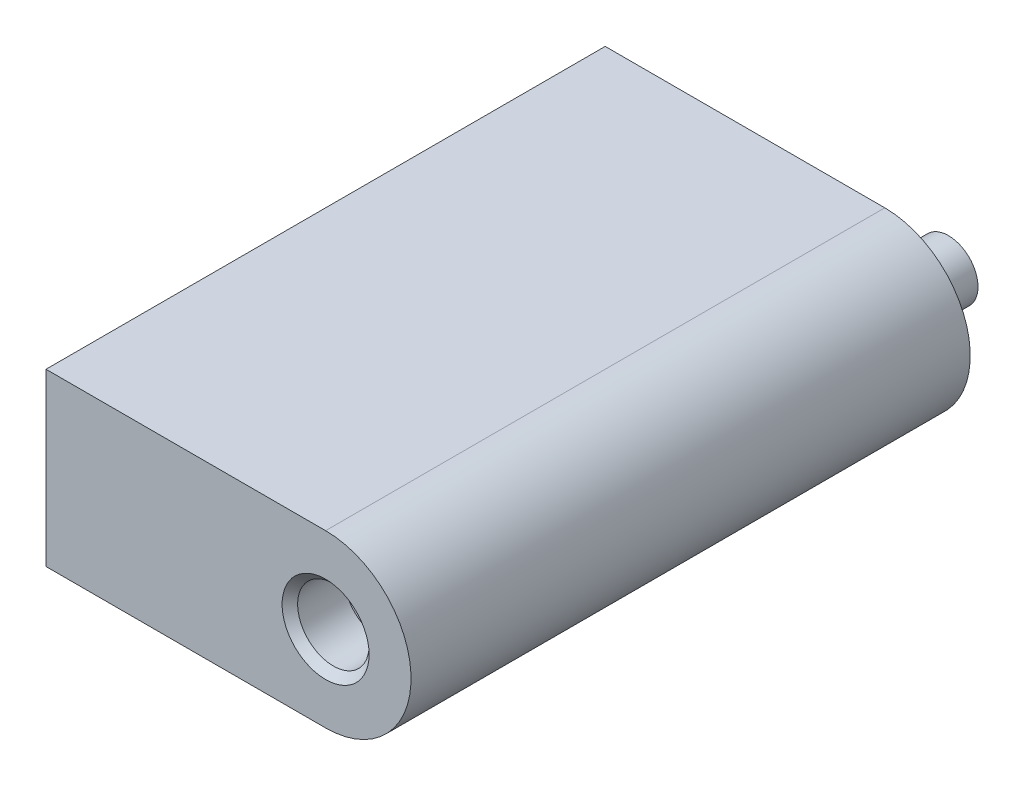
ISO-10303-21;
HEADER;
FILE_DESCRIPTION(('STEP AP214'),'2;1');
FILE_NAME('part.step','',(''),(''),'','','');
FILE_SCHEMA(('AUTOMOTIVE_DESIGN { 1 0 10303 214 1 1 1 1 }'));
ENDSEC;
DATA;
#1=APPLICATION_CONTEXT('core data for automotive mechanical design processes');
#2=APPLICATION_PROTOCOL_DEFINITION('international standard','automotive_design',2000,#1);
#3=PRODUCT_CONTEXT('',#1,'mechanical');
#4=PRODUCT('Part','Part','',(#3));
#5=PRODUCT_RELATED_PRODUCT_CATEGORY('part','',(#4));
#6=PRODUCT_DEFINITION_FORMATION('','',#4);
#7=PRODUCT_DEFINITION_CONTEXT('part definition',#1,'design');
#8=PRODUCT_DEFINITION('design','',#6,#7);
#9=PRODUCT_DEFINITION_SHAPE('','',#8);
#10=(LENGTH_UNIT() NAMED_UNIT(*) SI_UNIT(.MILLI.,.METRE.));
#11=(NAMED_UNIT(*) PLANE_ANGLE_UNIT() SI_UNIT($,.RADIAN.));
#12=(NAMED_UNIT(*) SI_UNIT($,.STERADIAN.) SOLID_ANGLE_UNIT());
#13=UNCERTAINTY_MEASURE_WITH_UNIT(LENGTH_MEASURE(1.E-05),#10,'distance_accuracy_value','');
#14=(GEOMETRIC_REPRESENTATION_CONTEXT(3) GLOBAL_UNCERTAINTY_ASSIGNED_CONTEXT((#13)) GLOBAL_UNIT_ASSIGNED_CONTEXT((#10,
#11,#12)) REPRESENTATION_CONTEXT('',''));
#15=CARTESIAN_POINT('',(0.,0.,0.));
#16=DIRECTION('',(0.,0.,1.));
#17=DIRECTION('',(1.,0.,0.));
#18=AXIS2_PLACEMENT_3D('',#15,#16,#17);
#19=CARTESIAN_POINT('',(0.,0.,36.));
#20=DIRECTION('',(0.,0.,-1.));
#21=DIRECTION('',(-1.,0.,0.));
#22=AXIS2_PLACEMENT_3D('',#19,#20,#21);
#23=CYLINDRICAL_SURFACE('',#22,5.5);
#24=CARTESIAN_POINT('',(0.,0.,0.));
#25=DIRECTION('',(0.,0.,1.));
#26=DIRECTION('',(1.,0.,0.));
#27=AXIS2_PLACEMENT_3D('',#24,#25,#26);
#28=CIRCLE('',#27,5.5);
#29=CARTESIAN_POINT('',(0.,-5.5,0.));
#30=VERTEX_POINT('',#29);
#31=CARTESIAN_POINT('',(0.,5.5,0.));
#32=VERTEX_POINT('',#31);
#33=EDGE_CURVE('E153',#30,#32,#28,.T.);
#34=ORIENTED_EDGE('',*,*,#33,.T.);
#35=DIRECTION('',(0.,0.,-1.));
#36=VECTOR('',#35,1.);
#37=CARTESIAN_POINT('',(0.,5.5,36.));
#38=LINE('',#37,#36);
#39=CARTESIAN_POINT('',(0.,5.5,36.));
#40=VERTEX_POINT('',#39);
#41=EDGE_CURVE('E183',#40,#32,#38,.T.);
#42=ORIENTED_EDGE('',*,*,#41,.F.);
#43=CARTESIAN_POINT('',(0.,0.,36.));
#44=DIRECTION('',(0.,0.,1.));
#45=DIRECTION('',(1.,0.,0.));
#46=AXIS2_PLACEMENT_3D('',#43,#44,#45);
#47=CIRCLE('',#46,5.5);
#48=CARTESIAN_POINT('',(0.,-5.5,36.));
#49=VERTEX_POINT('',#48);
#50=EDGE_CURVE('E157',#49,#40,#47,.T.);
#51=ORIENTED_EDGE('',*,*,#50,.F.);
#52=DIRECTION('',(0.,0.,-1.));
#53=VECTOR('',#52,1.);
#54=CARTESIAN_POINT('',(0.,-5.5,36.));
#55=LINE('',#54,#53);
#56=EDGE_CURVE('E167',#49,#30,#55,.T.);
#57=ORIENTED_EDGE('',*,*,#56,.T.);
#58=EDGE_LOOP('',(#34,#42,#51,#57));
#59=FACE_BOUND('',#58,.T.);
#60=ADVANCED_FACE('F41',(#59),#23,.T.);
#61=CARTESIAN_POINT('',(0.,5.5,36.));
#62=DIRECTION('',(0.,-1.,0.));
#63=DIRECTION('',(0.,0.,-1.));
#64=AXIS2_PLACEMENT_3D('',#61,#62,#63);
#65=PLANE('',#64);
#66=DIRECTION('',(-1.,0.,0.));
#67=VECTOR('',#66,1.);
#68=CARTESIAN_POINT('',(0.,5.5,0.));
#69=LINE('',#68,#67);
#70=CARTESIAN_POINT('',(-18.,5.5,0.));
#71=VERTEX_POINT('',#70);
#72=EDGE_CURVE('E170',#32,#71,#69,.T.);
#73=ORIENTED_EDGE('',*,*,#72,.T.);
#74=DIRECTION('',(0.,0.,-1.));
#75=VECTOR('',#74,1.);
#76=CARTESIAN_POINT('',(-18.,5.5,36.));
#77=LINE('',#76,#75);
#78=CARTESIAN_POINT('',(-18.,5.5,36.));
#79=VERTEX_POINT('',#78);
#80=EDGE_CURVE('E180',#79,#71,#77,.T.);
#81=ORIENTED_EDGE('',*,*,#80,.F.);
#82=DIRECTION('',(-1.,0.,0.));
#83=VECTOR('',#82,1.);
#84=CARTESIAN_POINT('',(0.,5.5,36.));
#85=LINE('',#84,#83);
#86=EDGE_CURVE('E160',#40,#79,#85,.T.);
#87=ORIENTED_EDGE('',*,*,#86,.F.);
#88=ORIENTED_EDGE('',*,*,#41,.T.);
#89=EDGE_LOOP('',(#73,#81,#87,#88));
#90=FACE_BOUND('',#89,.T.);
#91=ADVANCED_FACE('F243',(#90),#65,.F.);
#92=CARTESIAN_POINT('',(-18.,5.5,36.));
#93=DIRECTION('',(1.,0.,0.));
#94=DIRECTION('',(0.,0.,-1.));
#95=AXIS2_PLACEMENT_3D('',#92,#93,#94);
#96=PLANE('',#95);
#97=DIRECTION('',(0.,0.,-1.));
#98=VECTOR('',#97,1.);
#99=CARTESIAN_POINT('',(-18.,-5.,36.));
#100=LINE('',#99,#98);
#101=CARTESIAN_POINT('',(-18.,-5.,32.0475339143616));
#102=VERTEX_POINT('',#101);
#103=CARTESIAN_POINT('',(-18.,-5.,4.04753391436156));
#104=VERTEX_POINT('',#103);
#105=EDGE_CURVE('E203',#102,#104,#100,.T.);
#106=ORIENTED_EDGE('',*,*,#105,.T.);
#107=DIRECTION('',(0.,1.,0.));
#108=VECTOR('',#107,1.);
#109=CARTESIAN_POINT('',(-18.,5.49999999999999,4.04753391436156));
#110=LINE('',#109,#108);
#111=CARTESIAN_POINT('',(-18.,5.,4.04753391436156));
#112=VERTEX_POINT('',#111);
#113=EDGE_CURVE('E205',#104,#112,#110,.T.);
#114=ORIENTED_EDGE('',*,*,#113,.T.);
#115=DIRECTION('',(0.,0.,1.));
#116=VECTOR('',#115,1.);
#117=CARTESIAN_POINT('',(-18.,5.,36.));
#118=LINE('',#117,#116);
#119=CARTESIAN_POINT('',(-18.,5.,32.0475339143616));
#120=VERTEX_POINT('',#119);
#121=EDGE_CURVE('E201',#112,#120,#118,.T.);
#122=ORIENTED_EDGE('',*,*,#121,.T.);
#123=DIRECTION('',(0.,-1.,0.));
#124=VECTOR('',#123,1.);
#125=CARTESIAN_POINT('',(-18.,5.5,32.0475339143616));
#126=LINE('',#125,#124);
#127=EDGE_CURVE('E199',#120,#102,#126,.T.);
#128=ORIENTED_EDGE('',*,*,#127,.T.);
#129=EDGE_LOOP('',(#106,#114,#122,#128));
#130=FACE_BOUND('',#129,.T.);
#131=DIRECTION('',(0.,-1.,0.));
#132=VECTOR('',#131,1.);
#133=CARTESIAN_POINT('',(-18.,5.5,0.));
#134=LINE('',#133,#132);
#135=CARTESIAN_POINT('',(-18.,-5.5,0.));
#136=VERTEX_POINT('',#135);
#137=EDGE_CURVE('E172',#71,#136,#134,.T.);
#138=ORIENTED_EDGE('',*,*,#137,.T.);
#139=DIRECTION('',(0.,0.,-1.));
#140=VECTOR('',#139,1.);
#141=CARTESIAN_POINT('',(-18.,-5.5,36.));
#142=LINE('',#141,#140);
#143=CARTESIAN_POINT('',(-18.,-5.5,36.));
#144=VERTEX_POINT('',#143);
#145=EDGE_CURVE('E177',#144,#136,#142,.T.);
#146=ORIENTED_EDGE('',*,*,#145,.F.);
#147=DIRECTION('',(0.,-1.,0.));
#148=VECTOR('',#147,1.);
#149=CARTESIAN_POINT('',(-18.,5.5,36.));
#150=LINE('',#149,#148);
#151=EDGE_CURVE('E163',#79,#144,#150,.T.);
#152=ORIENTED_EDGE('',*,*,#151,.F.);
#153=ORIENTED_EDGE('',*,*,#80,.T.);
#154=EDGE_LOOP('',(#138,#146,#152,#153));
#155=FACE_BOUND('',#154,.T.);
#156=ADVANCED_FACE('F249',(#130,#155),#96,.F.);
#157=CARTESIAN_POINT('',(-18.,-5.5,36.));
#158=DIRECTION('',(0.,1.,0.));
#159=DIRECTION('',(0.,0.,1.));
#160=AXIS2_PLACEMENT_3D('',#157,#158,#159);
#161=PLANE('',#160);
#162=DIRECTION('',(1.,0.,0.));
#163=VECTOR('',#162,1.);
#164=CARTESIAN_POINT('',(-18.,-5.5,0.));
#165=LINE('',#164,#163);
#166=EDGE_CURVE('E161',#136,#30,#165,.T.);
#167=ORIENTED_EDGE('',*,*,#166,.T.);
#168=ORIENTED_EDGE('',*,*,#56,.F.);
#169=DIRECTION('',(1.,0.,0.));
#170=VECTOR('',#169,1.);
#171=CARTESIAN_POINT('',(-18.,-5.5,36.));
#172=LINE('',#171,#170);
#173=EDGE_CURVE('E165',#144,#49,#172,.T.);
#174=ORIENTED_EDGE('',*,*,#173,.F.);
#175=ORIENTED_EDGE('',*,*,#145,.T.);
#176=EDGE_LOOP('',(#167,#168,#174,#175));
#177=FACE_BOUND('',#176,.T.);
#178=ADVANCED_FACE('F312',(#177),#161,.F.);
#179=CARTESIAN_POINT('',(0.,0.,36.));
#180=DIRECTION('',(0.,0.,1.));
#181=DIRECTION('',(1.,0.,0.));
#182=AXIS2_PLACEMENT_3D('',#179,#180,#181);
#183=PLANE('',#182);
#184=CARTESIAN_POINT('',(0.,0.,36.));
#185=DIRECTION('',(0.,0.,1.));
#186=DIRECTION('',(1.,0.,0.));
#187=AXIS2_PLACEMENT_3D('',#184,#185,#186);
#188=CIRCLE('',#187,2.8);
#189=CARTESIAN_POINT('',(2.8,0.,36.));
#190=VERTEX_POINT('',#189);
#191=EDGE_CURVE('E195',#190,#190,#188,.F.);
#192=ORIENTED_EDGE('',*,*,#191,.T.);
#193=EDGE_LOOP('',(#192));
#194=FACE_BOUND('',#193,.T.);
#195=ORIENTED_EDGE('',*,*,#50,.T.);
#196=ORIENTED_EDGE('',*,*,#86,.T.);
#197=ORIENTED_EDGE('',*,*,#151,.T.);
#198=ORIENTED_EDGE('',*,*,#173,.T.);
#199=EDGE_LOOP('',(#195,#196,#197,#198));
#200=FACE_BOUND('',#199,.T.);
#201=ADVANCED_FACE('F309',(#194,#200),#183,.T.);
#202=CARTESIAN_POINT('',(0.,0.,0.));
#203=DIRECTION('',(0.,0.,1.));
#204=DIRECTION('',(1.,0.,0.));
#205=AXIS2_PLACEMENT_3D('',#202,#203,#204);
#206=PLANE('',#205);
#207=CARTESIAN_POINT('',(0.,0.,0.));
#208=DIRECTION('',(0.,0.,1.));
#209=DIRECTION('',(1.,0.,0.));
#210=AXIS2_PLACEMENT_3D('',#207,#208,#209);
#211=CIRCLE('',#210,2.9);
#212=CARTESIAN_POINT('',(2.9,0.,0.));
#213=VERTEX_POINT('',#212);
#214=EDGE_CURVE('E189',#213,#213,#211,.T.);
#215=ORIENTED_EDGE('',*,*,#214,.T.);
#216=EDGE_LOOP('',(#215));
#217=FACE_BOUND('',#216,.T.);
#218=ORIENTED_EDGE('',*,*,#33,.F.);
#219=ORIENTED_EDGE('',*,*,#166,.F.);
#220=ORIENTED_EDGE('',*,*,#137,.F.);
#221=ORIENTED_EDGE('',*,*,#72,.F.);
#222=EDGE_LOOP('',(#218,#219,#220,#221));
#223=FACE_BOUND('',#222,.T.);
#224=ADVANCED_FACE('F308',(#217,#223),#206,.F.);
#225=CARTESIAN_POINT('',(-9.,-4.5,4.54753391436156));
#226=DIRECTION('',(0.,0.,-1.));
#227=DIRECTION('',(0.,1.,0.));
#228=AXIS2_PLACEMENT_3D('',#225,#226,#227);
#229=PLANE('',#228);
#230=DIRECTION('',(-1.,0.,0.));
#231=VECTOR('',#230,1.);
#232=CARTESIAN_POINT('',(-9.,4.5,4.54753391436156));
#233=LINE('',#232,#231);
#234=CARTESIAN_POINT('',(-9.,4.5,4.54753391436156));
#235=VERTEX_POINT('',#234);
#236=CARTESIAN_POINT('',(-17.5,4.5,4.54753391436156));
#237=VERTEX_POINT('',#236);
#238=EDGE_CURVE('E151',#235,#237,#233,.T.);
#239=ORIENTED_EDGE('',*,*,#238,.T.);
#240=DIRECTION('',(0.,-1.,0.));
#241=VECTOR('',#240,1.);
#242=CARTESIAN_POINT('',(-17.5,-4.5,4.54753391436156));
#243=LINE('',#242,#241);
#244=CARTESIAN_POINT('',(-17.5,-4.5,4.54753391436156));
#245=VERTEX_POINT('',#244);
#246=EDGE_CURVE('E128',#237,#245,#243,.T.);
#247=ORIENTED_EDGE('',*,*,#246,.T.);
#248=DIRECTION('',(-1.,0.,0.));
#249=VECTOR('',#248,1.);
#250=CARTESIAN_POINT('',(-9.,-4.5,4.54753391436156));
#251=LINE('',#250,#249);
#252=CARTESIAN_POINT('',(-9.,-4.5,4.54753391436156));
#253=VERTEX_POINT('',#252);
#254=EDGE_CURVE('E120',#253,#245,#251,.T.);
#255=ORIENTED_EDGE('',*,*,#254,.F.);
#256=DIRECTION('',(0.,-1.,0.));
#257=VECTOR('',#256,1.);
#258=CARTESIAN_POINT('',(-9.,-4.5,4.54753391436156));
#259=LINE('',#258,#257);
#260=EDGE_CURVE('E125',#235,#253,#259,.T.);
#261=ORIENTED_EDGE('',*,*,#260,.F.);
#262=EDGE_LOOP('',(#239,#247,#255,#261));
#263=FACE_BOUND('',#262,.T.);
#264=ADVANCED_FACE('F123',(#263),#229,.F.);
#265=CARTESIAN_POINT('',(-9.,4.5,31.5475339143616));
#266=DIRECTION('',(0.,1.,0.));
#267=DIRECTION('',(0.,0.,1.));
#268=AXIS2_PLACEMENT_3D('',#265,#266,#267);
#269=PLANE('',#268);
#270=DIRECTION('',(-1.,0.,0.));
#271=VECTOR('',#270,1.);
#272=CARTESIAN_POINT('',(-9.,4.5,31.5475339143616));
#273=LINE('',#272,#271);
#274=CARTESIAN_POINT('',(-9.,4.5,31.5475339143616));
#275=VERTEX_POINT('',#274);
#276=CARTESIAN_POINT('',(-17.5,4.5,31.5475339143616));
#277=VERTEX_POINT('',#276);
#278=EDGE_CURVE('E154',#275,#277,#273,.T.);
#279=ORIENTED_EDGE('',*,*,#278,.T.);
#280=DIRECTION('',(0.,0.,-1.));
#281=VECTOR('',#280,1.);
#282=CARTESIAN_POINT('',(-17.5,4.5,31.5475339143616));
#283=LINE('',#282,#281);
#284=EDGE_CURVE('E51',#277,#237,#283,.T.);
#285=ORIENTED_EDGE('',*,*,#284,.T.);
#286=ORIENTED_EDGE('',*,*,#238,.F.);
#287=DIRECTION('',(0.,0.,-1.));
#288=VECTOR('',#287,1.);
#289=CARTESIAN_POINT('',(-9.,4.5,31.5475339143616));
#290=LINE('',#289,#288);
#291=EDGE_CURVE('E130',#275,#235,#290,.T.);
#292=ORIENTED_EDGE('',*,*,#291,.F.);
#293=EDGE_LOOP('',(#279,#285,#286,#292));
#294=FACE_BOUND('',#293,.T.);
#295=ADVANCED_FACE('F294',(#294),#269,.F.);
#296=CARTESIAN_POINT('',(-9.,-4.5,31.5475339143616));
#297=DIRECTION('',(0.,0.,1.));
#298=DIRECTION('',(1.,0.,0.));
#299=AXIS2_PLACEMENT_3D('',#296,#297,#298);
#300=PLANE('',#299);
#301=DIRECTION('',(-1.,0.,0.));
#302=VECTOR('',#301,1.);
#303=CARTESIAN_POINT('',(-9.,-4.5,31.5475339143616));
#304=LINE('',#303,#302);
#305=CARTESIAN_POINT('',(-9.,-4.5,31.5475339143616));
#306=VERTEX_POINT('',#305);
#307=CARTESIAN_POINT('',(-17.5,-4.5,31.5475339143616));
#308=VERTEX_POINT('',#307);
#309=EDGE_CURVE('E129',#306,#308,#304,.T.);
#310=ORIENTED_EDGE('',*,*,#309,.T.);
#311=DIRECTION('',(0.,1.,0.));
#312=VECTOR('',#311,1.);
#313=CARTESIAN_POINT('',(-17.5,-4.5,31.5475339143616));
#314=LINE('',#313,#312);
#315=EDGE_CURVE('E11',#308,#277,#314,.T.);
#316=ORIENTED_EDGE('',*,*,#315,.T.);
#317=ORIENTED_EDGE('',*,*,#278,.F.);
#318=DIRECTION('',(0.,1.,0.));
#319=VECTOR('',#318,1.);
#320=CARTESIAN_POINT('',(-9.,-4.5,31.5475339143616));
#321=LINE('',#320,#319);
#322=EDGE_CURVE('E138',#306,#275,#321,.T.);
#323=ORIENTED_EDGE('',*,*,#322,.F.);
#324=EDGE_LOOP('',(#310,#316,#317,#323));
#325=FACE_BOUND('',#324,.T.);
#326=ADVANCED_FACE('F295',(#325),#300,.F.);
#327=CARTESIAN_POINT('',(-9.,-4.5,31.5475339143616));
#328=DIRECTION('',(0.,-1.,0.));
#329=DIRECTION('',(0.,0.,-1.));
#330=AXIS2_PLACEMENT_3D('',#327,#328,#329);
#331=PLANE('',#330);
#332=ORIENTED_EDGE('',*,*,#254,.T.);
#333=DIRECTION('',(0.,0.,1.));
#334=VECTOR('',#333,1.);
#335=CARTESIAN_POINT('',(-17.5,-4.5,31.5475339143616));
#336=LINE('',#335,#334);
#337=EDGE_CURVE('E65',#245,#308,#336,.T.);
#338=ORIENTED_EDGE('',*,*,#337,.T.);
#339=ORIENTED_EDGE('',*,*,#309,.F.);
#340=DIRECTION('',(0.,0.,1.));
#341=VECTOR('',#340,1.);
#342=CARTESIAN_POINT('',(-9.,-4.5,31.5475339143616));
#343=LINE('',#342,#341);
#344=EDGE_CURVE('E133',#253,#306,#343,.T.);
#345=ORIENTED_EDGE('',*,*,#344,.F.);
#346=EDGE_LOOP('',(#332,#338,#339,#345));
#347=FACE_BOUND('',#346,.T.);
#348=ADVANCED_FACE('F134',(#347),#331,.F.);
#349=CARTESIAN_POINT('',(-9.,0.,0.));
#350=DIRECTION('',(-1.,0.,0.));
#351=DIRECTION('',(0.,0.,1.));
#352=AXIS2_PLACEMENT_3D('',#349,#350,#351);
#353=PLANE('',#352);
#354=ORIENTED_EDGE('',*,*,#260,.T.);
#355=ORIENTED_EDGE('',*,*,#344,.T.);
#356=ORIENTED_EDGE('',*,*,#322,.T.);
#357=ORIENTED_EDGE('',*,*,#291,.T.);
#358=EDGE_LOOP('',(#354,#355,#356,#357));
#359=FACE_BOUND('',#358,.T.);
#360=ADVANCED_FACE('F140',(#359),#353,.T.);
#361=CARTESIAN_POINT('',(0.,0.,32.5));
#362=DIRECTION('',(0.,0.,1.));
#363=DIRECTION('',(1.,0.,0.));
#364=AXIS2_PLACEMENT_3D('',#361,#362,#363);
#365=CYLINDRICAL_SURFACE('',#364,2.3);
#366=CARTESIAN_POINT('',(0.,0.,35.5));
#367=DIRECTION('',(0.,0.,1.));
#368=DIRECTION('',(1.,0.,0.));
#369=AXIS2_PLACEMENT_3D('',#366,#367,#368);
#370=CIRCLE('',#369,2.3);
#371=CARTESIAN_POINT('',(2.3,0.,35.5));
#372=VERTEX_POINT('',#371);
#373=EDGE_CURVE('E192',#372,#372,#370,.T.);
#374=ORIENTED_EDGE('',*,*,#373,.T.);
#375=EDGE_LOOP('',(#374));
#376=FACE_BOUND('',#375,.T.);
#377=CARTESIAN_POINT('',(0.,0.,32.5));
#378=DIRECTION('',(0.,0.,1.));
#379=DIRECTION('',(1.,0.,0.));
#380=AXIS2_PLACEMENT_3D('',#377,#378,#379);
#381=CIRCLE('',#380,2.3);
#382=CARTESIAN_POINT('',(2.3,0.,32.5));
#383=VERTEX_POINT('',#382);
#384=EDGE_CURVE('E142',#383,#383,#381,.T.);
#385=ORIENTED_EDGE('',*,*,#384,.F.);
#386=EDGE_LOOP('',(#385));
#387=FACE_BOUND('',#386,.T.);
#388=ADVANCED_FACE('F239',(#376,#387),#365,.F.);
#389=CARTESIAN_POINT('',(0.,0.,32.5));
#390=DIRECTION('',(0.,0.,1.));
#391=DIRECTION('',(1.,0.,0.));
#392=AXIS2_PLACEMENT_3D('',#389,#390,#391);
#393=PLANE('',#392);
#394=ORIENTED_EDGE('',*,*,#384,.T.);
#395=EDGE_LOOP('',(#394));
#396=FACE_BOUND('',#395,.T.);
#397=ADVANCED_FACE('F230',(#396),#393,.T.);
#398=CARTESIAN_POINT('',(0.,0.,-4.1));
#399=DIRECTION('',(0.,0.,1.));
#400=DIRECTION('',(1.,0.,0.));
#401=AXIS2_PLACEMENT_3D('',#398,#399,#400);
#402=CYLINDRICAL_SURFACE('',#401,1.9);
#403=CARTESIAN_POINT('',(0.,0.,-1.));
#404=DIRECTION('',(0.,0.,1.));
#405=DIRECTION('',(1.,0.,0.));
#406=AXIS2_PLACEMENT_3D('',#403,#404,#405);
#407=CIRCLE('',#406,1.9);
#408=CARTESIAN_POINT('',(1.9,0.,-1.));
#409=VERTEX_POINT('',#408);
#410=EDGE_CURVE('E186',#409,#409,#407,.F.);
#411=ORIENTED_EDGE('',*,*,#410,.T.);
#412=EDGE_LOOP('',(#411));
#413=FACE_BOUND('',#412,.T.);
#414=CARTESIAN_POINT('',(0.,0.,-4.1));
#415=DIRECTION('',(0.,0.,-1.));
#416=DIRECTION('',(-1.,0.,0.));
#417=AXIS2_PLACEMENT_3D('',#414,#415,#416);
#418=CIRCLE('',#417,1.9);
#419=CARTESIAN_POINT('',(-1.9,0.,-4.1));
#420=VERTEX_POINT('',#419);
#421=EDGE_CURVE('E145',#420,#420,#418,.T.);
#422=ORIENTED_EDGE('',*,*,#421,.F.);
#423=EDGE_LOOP('',(#422));
#424=FACE_BOUND('',#423,.T.);
#425=ADVANCED_FACE('F228',(#413,#424),#402,.T.);
#426=CARTESIAN_POINT('',(0.,0.,-4.1));
#427=DIRECTION('',(0.,0.,-1.));
#428=DIRECTION('',(-1.,0.,0.));
#429=AXIS2_PLACEMENT_3D('',#426,#427,#428);
#430=PLANE('',#429);
#431=ORIENTED_EDGE('',*,*,#421,.T.);
#432=EDGE_LOOP('',(#431));
#433=FACE_BOUND('',#432,.T.);
#434=ADVANCED_FACE('F226',(#433),#430,.T.);
#435=CARTESIAN_POINT('',(0.,0.,-1.));
#436=DIRECTION('',(0.,0.,1.));
#437=DIRECTION('',(1.,0.,0.));
#438=AXIS2_PLACEMENT_3D('',#435,#436,#437);
#439=TOROIDAL_SURFACE('',#438,2.9,1.);
#440=ORIENTED_EDGE('',*,*,#214,.F.);
#441=EDGE_LOOP('',(#440));
#442=FACE_BOUND('',#441,.T.);
#443=ORIENTED_EDGE('',*,*,#410,.F.);
#444=EDGE_LOOP('',(#443));
#445=FACE_BOUND('',#444,.T.);
#446=ADVANCED_FACE('F237',(#442,#445),#439,.F.);
#447=CARTESIAN_POINT('',(0.,0.,35.5));
#448=DIRECTION('',(0.,0.,1.));
#449=DIRECTION('',(1.,0.,0.));
#450=AXIS2_PLACEMENT_3D('',#447,#448,#449);
#451=CONICAL_SURFACE('',#450,2.3,0.785398163397445);
#452=ORIENTED_EDGE('',*,*,#191,.F.);
#453=EDGE_LOOP('',(#452));
#454=FACE_BOUND('',#453,.T.);
#455=ORIENTED_EDGE('',*,*,#373,.F.);
#456=EDGE_LOOP('',(#455));
#457=FACE_BOUND('',#456,.T.);
#458=ADVANCED_FACE('F256',(#454,#457),#451,.F.);
#459=CARTESIAN_POINT('',(-17.5,-4.5,31.5475339143616));
#460=DIRECTION('',(0.707106781186552,0.,0.707106781186543));
#461=DIRECTION('',(0.,1.,0.));
#462=AXIS2_PLACEMENT_3D('',#459,#460,#461);
#463=PLANE('',#462);
#464=DIRECTION('',(-0.57735026918962,-0.577350269189629,0.577350269189628));
#465=VECTOR('',#464,1.);
#466=CARTESIAN_POINT('',(-17.5,-4.5,31.5475339143616));
#467=LINE('',#466,#465);
#468=EDGE_CURVE('E213',#102,#308,#467,.F.);
#469=ORIENTED_EDGE('',*,*,#468,.F.);
#470=ORIENTED_EDGE('',*,*,#127,.F.);
#471=DIRECTION('',(0.577350269189621,-0.577350269189628,-0.577350269189629));
#472=VECTOR('',#471,1.);
#473=CARTESIAN_POINT('',(-17.5,4.5,31.5475339143616));
#474=LINE('',#473,#472);
#475=EDGE_CURVE('E46',#277,#120,#474,.F.);
#476=ORIENTED_EDGE('',*,*,#475,.F.);
#477=ORIENTED_EDGE('',*,*,#315,.F.);
#478=EDGE_LOOP('',(#469,#470,#476,#477));
#479=FACE_BOUND('',#478,.T.);
#480=ADVANCED_FACE('F44',(#479),#463,.F.);
#481=CARTESIAN_POINT('',(-17.5,4.5,31.5475339143616));
#482=DIRECTION('',(0.707106781186552,0.707106781186543,0.));
#483=DIRECTION('',(0.,0.,-1.));
#484=AXIS2_PLACEMENT_3D('',#481,#482,#483);
#485=PLANE('',#484);
#486=ORIENTED_EDGE('',*,*,#475,.T.);
#487=ORIENTED_EDGE('',*,*,#121,.F.);
#488=DIRECTION('',(0.577350269189619,-0.577350269189627,0.577350269189631));
#489=VECTOR('',#488,1.);
#490=CARTESIAN_POINT('',(-14.5,1.49999999999999,7.5475339143616));
#491=LINE('',#490,#489);
#492=EDGE_CURVE('E212',#237,#112,#491,.F.);
#493=ORIENTED_EDGE('',*,*,#492,.F.);
#494=ORIENTED_EDGE('',*,*,#284,.F.);
#495=EDGE_LOOP('',(#486,#487,#493,#494));
#496=FACE_BOUND('',#495,.T.);
#497=ADVANCED_FACE('F277',(#496),#485,.F.);
#498=CARTESIAN_POINT('',(-17.5,-4.5,31.5475339143616));
#499=DIRECTION('',(0.707106781186553,-0.707106781186542,0.));
#500=DIRECTION('',(0.,0.,1.));
#501=AXIS2_PLACEMENT_3D('',#498,#499,#500);
#502=PLANE('',#501);
#503=ORIENTED_EDGE('',*,*,#468,.T.);
#504=ORIENTED_EDGE('',*,*,#337,.F.);
#505=DIRECTION('',(-0.577350269189619,-0.577350269189628,-0.57735026918963));
#506=VECTOR('',#505,1.);
#507=CARTESIAN_POINT('',(-17.5,-4.5,4.54753391436156));
#508=LINE('',#507,#506);
#509=EDGE_CURVE('E210',#104,#245,#508,.F.);
#510=ORIENTED_EDGE('',*,*,#509,.F.);
#511=ORIENTED_EDGE('',*,*,#105,.F.);
#512=EDGE_LOOP('',(#503,#504,#510,#511));
#513=FACE_BOUND('',#512,.T.);
#514=ADVANCED_FACE('F271',(#513),#502,.F.);
#515=CARTESIAN_POINT('',(-17.5,-4.5,4.54753391436156));
#516=DIRECTION('',(0.707106781186555,0.,-0.70710678118654));
#517=DIRECTION('',(0.,-1.,0.));
#518=AXIS2_PLACEMENT_3D('',#515,#516,#517);
#519=PLANE('',#518);
#520=ORIENTED_EDGE('',*,*,#492,.T.);
#521=ORIENTED_EDGE('',*,*,#113,.F.);
#522=ORIENTED_EDGE('',*,*,#509,.T.);
#523=ORIENTED_EDGE('',*,*,#246,.F.);
#524=EDGE_LOOP('',(#520,#521,#522,#523));
#525=FACE_BOUND('',#524,.T.);
#526=ADVANCED_FACE('F265',(#525),#519,.F.);
#527=CLOSED_SHELL('',(#60,#91,#156,#178,#201,#224,#264,#295,#326,#348,#360,#388,#397,#425,#434,
#446,#458,#480,#497,#514,#526));
#528=MANIFOLD_SOLID_BREP('B2',#527);
#529=ADVANCED_BREP_SHAPE_REPRESENTATION('',(#18,#528),#14);
#530=SHAPE_DEFINITION_REPRESENTATION(#9,#529);
ENDSEC;
END-ISO-10303-21;
